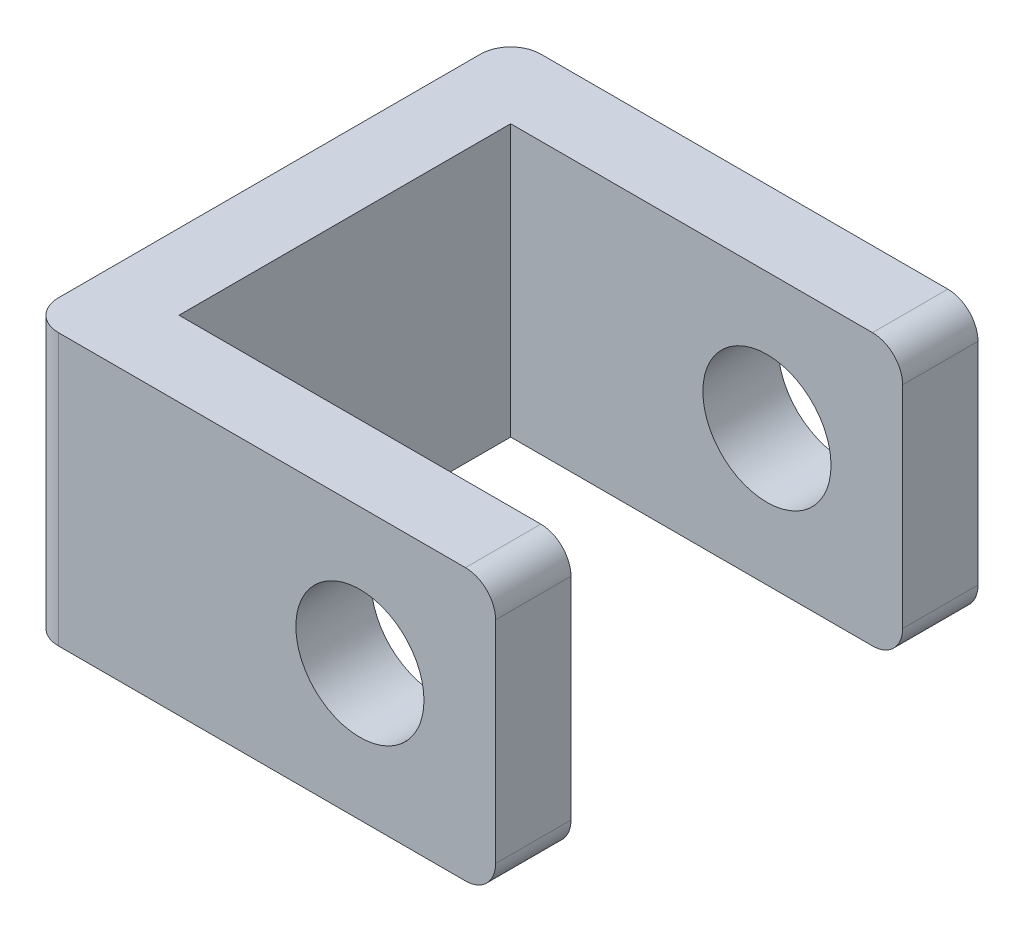
ISO-10303-21;
HEADER;
FILE_DESCRIPTION(('STEP AP214'),'2;1');
FILE_NAME('part.step','',(''),(''),'','','');
FILE_SCHEMA(('AUTOMOTIVE_DESIGN { 1 0 10303 214 1 1 1 1 }'));
ENDSEC;
DATA;
#1=APPLICATION_CONTEXT('core data for automotive mechanical design processes');
#2=APPLICATION_PROTOCOL_DEFINITION('international standard','automotive_design',2000,#1);
#3=PRODUCT_CONTEXT('',#1,'mechanical');
#4=PRODUCT('Part','Part','',(#3));
#5=PRODUCT_RELATED_PRODUCT_CATEGORY('part','',(#4));
#6=PRODUCT_DEFINITION_FORMATION('','',#4);
#7=PRODUCT_DEFINITION_CONTEXT('part definition',#1,'design');
#8=PRODUCT_DEFINITION('design','',#6,#7);
#9=PRODUCT_DEFINITION_SHAPE('','',#8);
#10=(LENGTH_UNIT() NAMED_UNIT(*) SI_UNIT(.MILLI.,.METRE.));
#11=(NAMED_UNIT(*) PLANE_ANGLE_UNIT() SI_UNIT($,.RADIAN.));
#12=(NAMED_UNIT(*) SI_UNIT($,.STERADIAN.) SOLID_ANGLE_UNIT());
#13=UNCERTAINTY_MEASURE_WITH_UNIT(LENGTH_MEASURE(1.E-05),#10,'distance_accuracy_value','');
#14=(GEOMETRIC_REPRESENTATION_CONTEXT(3) GLOBAL_UNCERTAINTY_ASSIGNED_CONTEXT((#13)) GLOBAL_UNIT_ASSIGNED_CONTEXT((#10,
#11,#12)) REPRESENTATION_CONTEXT('',''));
#15=CARTESIAN_POINT('',(0.,0.,0.));
#16=DIRECTION('',(0.,0.,1.));
#17=DIRECTION('',(1.,0.,0.));
#18=AXIS2_PLACEMENT_3D('',#15,#16,#17);
#19=CARTESIAN_POINT('',(2.,18.,14.));
#20=DIRECTION('',(0.,-1.,0.));
#21=DIRECTION('',(0.,0.,-1.));
#22=AXIS2_PLACEMENT_3D('',#19,#20,#21);
#23=CYLINDRICAL_SURFACE('',#22,2.);
#24=CARTESIAN_POINT('',(2.,0.,14.));
#25=DIRECTION('',(0.,1.,0.));
#26=DIRECTION('',(0.,0.,-1.));
#27=AXIS2_PLACEMENT_3D('',#24,#25,#26);
#28=CIRCLE('',#27,2.);
#29=CARTESIAN_POINT('',(0.,0.,14.));
#30=VERTEX_POINT('',#29);
#31=CARTESIAN_POINT('',(2.00000000000002,0.,16.));
#32=VERTEX_POINT('',#31);
#33=EDGE_CURVE('E163',#30,#32,#28,.T.);
#34=ORIENTED_EDGE('',*,*,#33,.T.);
#35=DIRECTION('',(0.,-1.,0.));
#36=VECTOR('',#35,1.);
#37=CARTESIAN_POINT('',(2.00000000000002,18.,16.));
#38=LINE('',#37,#36);
#39=CARTESIAN_POINT('',(2.00000000000002,18.,16.));
#40=VERTEX_POINT('',#39);
#41=EDGE_CURVE('E142',#40,#32,#38,.T.);
#42=ORIENTED_EDGE('',*,*,#41,.F.);
#43=CARTESIAN_POINT('',(2.,18.,14.));
#44=DIRECTION('',(0.,1.,0.));
#45=DIRECTION('',(0.,0.,-1.));
#46=AXIS2_PLACEMENT_3D('',#43,#44,#45);
#47=CIRCLE('',#46,2.);
#48=CARTESIAN_POINT('',(0.,18.,14.));
#49=VERTEX_POINT('',#48);
#50=EDGE_CURVE('E151',#49,#40,#47,.T.);
#51=ORIENTED_EDGE('',*,*,#50,.F.);
#52=DIRECTION('',(0.,-1.,0.));
#53=VECTOR('',#52,1.);
#54=CARTESIAN_POINT('',(0.,18.,14.));
#55=LINE('',#54,#53);
#56=EDGE_CURVE('E218',#49,#30,#55,.T.);
#57=ORIENTED_EDGE('',*,*,#56,.T.);
#58=EDGE_LOOP('',(#34,#42,#51,#57));
#59=FACE_BOUND('',#58,.T.);
#60=ADVANCED_FACE('F34',(#59),#23,.T.);
#61=CARTESIAN_POINT('',(2.00000000000002,18.,16.));
#62=DIRECTION('',(0.,0.,-1.));
#63=DIRECTION('',(-1.,0.,0.));
#64=AXIS2_PLACEMENT_3D('',#61,#62,#63);
#65=PLANE('',#64);
#66=CARTESIAN_POINT('',(22.,9.,16.));
#67=DIRECTION('',(0.,0.,1.));
#68=DIRECTION('',(1.,0.,0.));
#69=AXIS2_PLACEMENT_3D('',#66,#67,#68);
#70=CIRCLE('',#69,4.25);
#71=CARTESIAN_POINT('',(26.25,9.,16.));
#72=VERTEX_POINT('',#71);
#73=EDGE_CURVE('E442',#72,#72,#70,.T.);
#74=ORIENTED_EDGE('',*,*,#73,.F.);
#75=EDGE_LOOP('',(#74));
#76=FACE_BOUND('',#75,.T.);
#77=DIRECTION('',(1.,0.,0.));
#78=VECTOR('',#77,1.);
#79=CARTESIAN_POINT('',(2.00000000000002,0.,16.));
#80=LINE('',#79,#78);
#81=CARTESIAN_POINT('',(29.,0.,16.));
#82=VERTEX_POINT('',#81);
#83=EDGE_CURVE('E220',#32,#82,#80,.T.);
#84=ORIENTED_EDGE('',*,*,#83,.T.);
#85=CARTESIAN_POINT('',(29.,2.,16.));
#86=DIRECTION('',(0.,0.,-1.));
#87=DIRECTION('',(-1.,0.,0.));
#88=AXIS2_PLACEMENT_3D('',#85,#86,#87);
#89=CIRCLE('',#88,2.);
#90=CARTESIAN_POINT('',(31.,2.,16.));
#91=VERTEX_POINT('',#90);
#92=EDGE_CURVE('E185',#82,#91,#89,.F.);
#93=ORIENTED_EDGE('',*,*,#92,.T.);
#94=DIRECTION('',(0.,-1.,0.));
#95=VECTOR('',#94,1.);
#96=CARTESIAN_POINT('',(31.,18.,16.));
#97=LINE('',#96,#95);
#98=CARTESIAN_POINT('',(31.,16.,16.));
#99=VERTEX_POINT('',#98);
#100=EDGE_CURVE('E165',#99,#91,#97,.T.);
#101=ORIENTED_EDGE('',*,*,#100,.F.);
#102=CARTESIAN_POINT('',(29.,16.,16.));
#103=DIRECTION('',(0.,0.,-1.));
#104=DIRECTION('',(-1.,0.,0.));
#105=AXIS2_PLACEMENT_3D('',#102,#103,#104);
#106=CIRCLE('',#105,2.);
#107=CARTESIAN_POINT('',(29.,18.,16.));
#108=VERTEX_POINT('',#107);
#109=EDGE_CURVE('E146',#99,#108,#106,.F.);
#110=ORIENTED_EDGE('',*,*,#109,.T.);
#111=DIRECTION('',(1.,0.,0.));
#112=VECTOR('',#111,1.);
#113=CARTESIAN_POINT('',(2.00000000000002,18.,16.));
#114=LINE('',#113,#112);
#115=EDGE_CURVE('E137',#40,#108,#114,.T.);
#116=ORIENTED_EDGE('',*,*,#115,.F.);
#117=ORIENTED_EDGE('',*,*,#41,.T.);
#118=EDGE_LOOP('',(#84,#93,#101,#110,#116,#117));
#119=FACE_BOUND('',#118,.T.);
#120=ADVANCED_FACE('F140',(#76,#119),#65,.F.);
#121=CARTESIAN_POINT('',(31.,18.,16.));
#122=DIRECTION('',(-1.,0.,0.));
#123=DIRECTION('',(0.,0.,1.));
#124=AXIS2_PLACEMENT_3D('',#121,#122,#123);
#125=PLANE('',#124);
#126=ORIENTED_EDGE('',*,*,#100,.T.);
#127=DIRECTION('',(0.,0.,-1.));
#128=VECTOR('',#127,1.);
#129=CARTESIAN_POINT('',(31.,2.,11.));
#130=LINE('',#129,#128);
#131=CARTESIAN_POINT('',(31.,2.,11.));
#132=VERTEX_POINT('',#131);
#133=EDGE_CURVE('E167',#91,#132,#130,.T.);
#134=ORIENTED_EDGE('',*,*,#133,.T.);
#135=DIRECTION('',(0.,-1.,0.));
#136=VECTOR('',#135,1.);
#137=CARTESIAN_POINT('',(31.,18.,11.));
#138=LINE('',#137,#136);
#139=CARTESIAN_POINT('',(31.,16.,11.));
#140=VERTEX_POINT('',#139);
#141=EDGE_CURVE('E170',#140,#132,#138,.T.);
#142=ORIENTED_EDGE('',*,*,#141,.F.);
#143=DIRECTION('',(0.,0.,-1.));
#144=VECTOR('',#143,1.);
#145=CARTESIAN_POINT('',(31.,16.,16.));
#146=LINE('',#145,#144);
#147=EDGE_CURVE('E164',#140,#99,#146,.F.);
#148=ORIENTED_EDGE('',*,*,#147,.T.);
#149=EDGE_LOOP('',(#126,#134,#142,#148));
#150=FACE_BOUND('',#149,.T.);
#151=ADVANCED_FACE('F254',(#150),#125,.F.);
#152=CARTESIAN_POINT('',(31.,18.,11.));
#153=DIRECTION('',(0.,0.,1.));
#154=DIRECTION('',(1.,0.,0.));
#155=AXIS2_PLACEMENT_3D('',#152,#153,#154);
#156=PLANE('',#155);
#157=CARTESIAN_POINT('',(22.,9.,11.));
#158=DIRECTION('',(0.,0.,1.));
#159=DIRECTION('',(1.,0.,0.));
#160=AXIS2_PLACEMENT_3D('',#157,#158,#159);
#161=CIRCLE('',#160,4.25);
#162=CARTESIAN_POINT('',(26.25,9.,11.));
#163=VERTEX_POINT('',#162);
#164=EDGE_CURVE('E221',#163,#163,#161,.T.);
#165=ORIENTED_EDGE('',*,*,#164,.T.);
#166=EDGE_LOOP('',(#165));
#167=FACE_BOUND('',#166,.T.);
#168=ORIENTED_EDGE('',*,*,#141,.T.);
#169=CARTESIAN_POINT('',(29.,2.,11.));
#170=DIRECTION('',(0.,0.,1.));
#171=DIRECTION('',(1.,0.,0.));
#172=AXIS2_PLACEMENT_3D('',#169,#170,#171);
#173=CIRCLE('',#172,2.);
#174=CARTESIAN_POINT('',(29.,0.,11.));
#175=VERTEX_POINT('',#174);
#176=EDGE_CURVE('E178',#132,#175,#173,.F.);
#177=ORIENTED_EDGE('',*,*,#176,.T.);
#178=DIRECTION('',(-1.,0.,0.));
#179=VECTOR('',#178,1.);
#180=CARTESIAN_POINT('',(31.,0.,11.));
#181=LINE('',#180,#179);
#182=CARTESIAN_POINT('',(5.,0.,11.));
#183=VERTEX_POINT('',#182);
#184=EDGE_CURVE('E223',#175,#183,#181,.T.);
#185=ORIENTED_EDGE('',*,*,#184,.T.);
#186=DIRECTION('',(0.,-1.,0.));
#187=VECTOR('',#186,1.);
#188=CARTESIAN_POINT('',(5.,18.,11.));
#189=LINE('',#188,#187);
#190=CARTESIAN_POINT('',(5.,18.,11.));
#191=VERTEX_POINT('',#190);
#192=EDGE_CURVE('E205',#191,#183,#189,.T.);
#193=ORIENTED_EDGE('',*,*,#192,.F.);
#194=DIRECTION('',(-1.,0.,0.));
#195=VECTOR('',#194,1.);
#196=CARTESIAN_POINT('',(31.,18.,11.));
#197=LINE('',#196,#195);
#198=CARTESIAN_POINT('',(29.,18.,11.));
#199=VERTEX_POINT('',#198);
#200=EDGE_CURVE('E150',#199,#191,#197,.T.);
#201=ORIENTED_EDGE('',*,*,#200,.F.);
#202=CARTESIAN_POINT('',(29.,16.,11.));
#203=DIRECTION('',(0.,0.,1.));
#204=DIRECTION('',(1.,0.,0.));
#205=AXIS2_PLACEMENT_3D('',#202,#203,#204);
#206=CIRCLE('',#205,2.);
#207=EDGE_CURVE('E176',#199,#140,#206,.F.);
#208=ORIENTED_EDGE('',*,*,#207,.T.);
#209=EDGE_LOOP('',(#168,#177,#185,#193,#201,#208));
#210=FACE_BOUND('',#209,.T.);
#211=ADVANCED_FACE('F202',(#167,#210),#156,.F.);
#212=CARTESIAN_POINT('',(5.,18.,11.));
#213=DIRECTION('',(-1.,0.,0.));
#214=DIRECTION('',(0.,0.,1.));
#215=AXIS2_PLACEMENT_3D('',#212,#213,#214);
#216=PLANE('',#215);
#217=DIRECTION('',(0.,0.,-1.));
#218=VECTOR('',#217,1.);
#219=CARTESIAN_POINT('',(5.,0.,11.));
#220=LINE('',#219,#218);
#221=CARTESIAN_POINT('',(5.,0.,-11.));
#222=VERTEX_POINT('',#221);
#223=EDGE_CURVE('E225',#183,#222,#220,.T.);
#224=ORIENTED_EDGE('',*,*,#223,.T.);
#225=DIRECTION('',(0.,-1.,0.));
#226=VECTOR('',#225,1.);
#227=CARTESIAN_POINT('',(5.,18.,-11.));
#228=LINE('',#227,#226);
#229=CARTESIAN_POINT('',(5.,18.,-11.));
#230=VERTEX_POINT('',#229);
#231=EDGE_CURVE('E248',#230,#222,#228,.T.);
#232=ORIENTED_EDGE('',*,*,#231,.F.);
#233=DIRECTION('',(0.,0.,-1.));
#234=VECTOR('',#233,1.);
#235=CARTESIAN_POINT('',(5.,18.,11.));
#236=LINE('',#235,#234);
#237=EDGE_CURVE('E207',#191,#230,#236,.T.);
#238=ORIENTED_EDGE('',*,*,#237,.F.);
#239=ORIENTED_EDGE('',*,*,#192,.T.);
#240=EDGE_LOOP('',(#224,#232,#238,#239));
#241=FACE_BOUND('',#240,.T.);
#242=ADVANCED_FACE('F311',(#241),#216,.F.);
#243=CARTESIAN_POINT('',(5.,18.,-11.));
#244=DIRECTION('',(0.,0.,-1.));
#245=DIRECTION('',(-1.,0.,0.));
#246=AXIS2_PLACEMENT_3D('',#243,#244,#245);
#247=PLANE('',#246);
#248=CARTESIAN_POINT('',(22.,9.,-11.));
#249=DIRECTION('',(0.,0.,-1.));
#250=DIRECTION('',(-1.,0.,0.));
#251=AXIS2_PLACEMENT_3D('',#248,#249,#250);
#252=CIRCLE('',#251,4.25);
#253=CARTESIAN_POINT('',(17.75,9.,-11.));
#254=VERTEX_POINT('',#253);
#255=EDGE_CURVE('E445',#254,#254,#252,.T.);
#256=ORIENTED_EDGE('',*,*,#255,.T.);
#257=EDGE_LOOP('',(#256));
#258=FACE_BOUND('',#257,.T.);
#259=DIRECTION('',(1.,0.,0.));
#260=VECTOR('',#259,1.);
#261=CARTESIAN_POINT('',(5.,0.,-11.));
#262=LINE('',#261,#260);
#263=CARTESIAN_POINT('',(29.,0.,-11.));
#264=VERTEX_POINT('',#263);
#265=EDGE_CURVE('E227',#222,#264,#262,.T.);
#266=ORIENTED_EDGE('',*,*,#265,.T.);
#267=CARTESIAN_POINT('',(29.,2.,-11.));
#268=DIRECTION('',(0.,0.,-1.));
#269=DIRECTION('',(-1.,0.,0.));
#270=AXIS2_PLACEMENT_3D('',#267,#268,#269);
#271=CIRCLE('',#270,2.);
#272=CARTESIAN_POINT('',(31.,2.,-11.));
#273=VERTEX_POINT('',#272);
#274=EDGE_CURVE('E196',#264,#273,#271,.F.);
#275=ORIENTED_EDGE('',*,*,#274,.T.);
#276=DIRECTION('',(0.,-1.,0.));
#277=VECTOR('',#276,1.);
#278=CARTESIAN_POINT('',(31.,18.,-11.));
#279=LINE('',#278,#277);
#280=CARTESIAN_POINT('',(31.,16.,-11.));
#281=VERTEX_POINT('',#280);
#282=EDGE_CURVE('E245',#281,#273,#279,.T.);
#283=ORIENTED_EDGE('',*,*,#282,.F.);
#284=CARTESIAN_POINT('',(29.,16.,-11.));
#285=DIRECTION('',(0.,0.,-1.));
#286=DIRECTION('',(-1.,0.,0.));
#287=AXIS2_PLACEMENT_3D('',#284,#285,#286);
#288=CIRCLE('',#287,2.);
#289=CARTESIAN_POINT('',(29.,18.,-11.));
#290=VERTEX_POINT('',#289);
#291=EDGE_CURVE('E49',#281,#290,#288,.F.);
#292=ORIENTED_EDGE('',*,*,#291,.T.);
#293=DIRECTION('',(1.,0.,0.));
#294=VECTOR('',#293,1.);
#295=CARTESIAN_POINT('',(5.,18.,-11.));
#296=LINE('',#295,#294);
#297=EDGE_CURVE('E209',#230,#290,#296,.T.);
#298=ORIENTED_EDGE('',*,*,#297,.F.);
#299=ORIENTED_EDGE('',*,*,#231,.T.);
#300=EDGE_LOOP('',(#266,#275,#283,#292,#298,#299));
#301=FACE_BOUND('',#300,.T.);
#302=ADVANCED_FACE('F288',(#258,#301),#247,.F.);
#303=CARTESIAN_POINT('',(31.,18.,-11.));
#304=DIRECTION('',(-1.,0.,0.));
#305=DIRECTION('',(0.,0.,1.));
#306=AXIS2_PLACEMENT_3D('',#303,#304,#305);
#307=PLANE('',#306);
#308=ORIENTED_EDGE('',*,*,#282,.T.);
#309=DIRECTION('',(0.,0.,-1.));
#310=VECTOR('',#309,1.);
#311=CARTESIAN_POINT('',(31.,2.,-16.));
#312=LINE('',#311,#310);
#313=CARTESIAN_POINT('',(31.,2.,-16.));
#314=VERTEX_POINT('',#313);
#315=EDGE_CURVE('E189',#273,#314,#312,.T.);
#316=ORIENTED_EDGE('',*,*,#315,.T.);
#317=DIRECTION('',(0.,-1.,0.));
#318=VECTOR('',#317,1.);
#319=CARTESIAN_POINT('',(31.,18.,-16.));
#320=LINE('',#319,#318);
#321=CARTESIAN_POINT('',(31.,16.,-16.));
#322=VERTEX_POINT('',#321);
#323=EDGE_CURVE('E242',#322,#314,#320,.T.);
#324=ORIENTED_EDGE('',*,*,#323,.F.);
#325=DIRECTION('',(0.,0.,-1.));
#326=VECTOR('',#325,1.);
#327=CARTESIAN_POINT('',(31.,16.,-11.));
#328=LINE('',#327,#326);
#329=EDGE_CURVE('E187',#322,#281,#328,.F.);
#330=ORIENTED_EDGE('',*,*,#329,.T.);
#331=EDGE_LOOP('',(#308,#316,#324,#330));
#332=FACE_BOUND('',#331,.T.);
#333=ADVANCED_FACE('F291',(#332),#307,.F.);
#334=CARTESIAN_POINT('',(31.,18.,-16.));
#335=DIRECTION('',(0.,0.,1.));
#336=DIRECTION('',(1.,0.,0.));
#337=AXIS2_PLACEMENT_3D('',#334,#335,#336);
#338=PLANE('',#337);
#339=CARTESIAN_POINT('',(22.,9.,-16.));
#340=DIRECTION('',(0.,0.,1.));
#341=DIRECTION('',(1.,0.,0.));
#342=AXIS2_PLACEMENT_3D('',#339,#340,#341);
#343=CIRCLE('',#342,4.25);
#344=CARTESIAN_POINT('',(26.25,9.,-16.));
#345=VERTEX_POINT('',#344);
#346=EDGE_CURVE('E448',#345,#345,#343,.T.);
#347=ORIENTED_EDGE('',*,*,#346,.T.);
#348=EDGE_LOOP('',(#347));
#349=FACE_BOUND('',#348,.T.);
#350=ORIENTED_EDGE('',*,*,#323,.T.);
#351=CARTESIAN_POINT('',(29.,2.,-16.));
#352=DIRECTION('',(0.,0.,1.));
#353=DIRECTION('',(1.,0.,0.));
#354=AXIS2_PLACEMENT_3D('',#351,#352,#353);
#355=CIRCLE('',#354,2.);
#356=CARTESIAN_POINT('',(29.,0.,-16.));
#357=VERTEX_POINT('',#356);
#358=EDGE_CURVE('E193',#314,#357,#355,.F.);
#359=ORIENTED_EDGE('',*,*,#358,.T.);
#360=DIRECTION('',(-1.,0.,0.));
#361=VECTOR('',#360,1.);
#362=CARTESIAN_POINT('',(31.,0.,-16.));
#363=LINE('',#362,#361);
#364=CARTESIAN_POINT('',(2.00000000000001,0.,-16.));
#365=VERTEX_POINT('',#364);
#366=EDGE_CURVE('E230',#357,#365,#363,.T.);
#367=ORIENTED_EDGE('',*,*,#366,.T.);
#368=DIRECTION('',(0.,-1.,0.));
#369=VECTOR('',#368,1.);
#370=CARTESIAN_POINT('',(2.00000000000001,18.,-16.));
#371=LINE('',#370,#369);
#372=CARTESIAN_POINT('',(2.00000000000001,18.,-16.));
#373=VERTEX_POINT('',#372);
#374=EDGE_CURVE('E239',#373,#365,#371,.T.);
#375=ORIENTED_EDGE('',*,*,#374,.F.);
#376=DIRECTION('',(-1.,0.,0.));
#377=VECTOR('',#376,1.);
#378=CARTESIAN_POINT('',(31.,18.,-16.));
#379=LINE('',#378,#377);
#380=CARTESIAN_POINT('',(29.,18.,-16.));
#381=VERTEX_POINT('',#380);
#382=EDGE_CURVE('E213',#381,#373,#379,.T.);
#383=ORIENTED_EDGE('',*,*,#382,.F.);
#384=CARTESIAN_POINT('',(29.,16.,-16.));
#385=DIRECTION('',(0.,0.,1.));
#386=DIRECTION('',(1.,0.,0.));
#387=AXIS2_PLACEMENT_3D('',#384,#385,#386);
#388=CIRCLE('',#387,2.);
#389=EDGE_CURVE('E57',#381,#322,#388,.F.);
#390=ORIENTED_EDGE('',*,*,#389,.T.);
#391=EDGE_LOOP('',(#350,#359,#367,#375,#383,#390));
#392=FACE_BOUND('',#391,.T.);
#393=ADVANCED_FACE('F296',(#349,#392),#338,.F.);
#394=CARTESIAN_POINT('',(2.,18.,-14.));
#395=DIRECTION('',(0.,-1.,0.));
#396=DIRECTION('',(0.,0.,-1.));
#397=AXIS2_PLACEMENT_3D('',#394,#395,#396);
#398=CYLINDRICAL_SURFACE('',#397,2.);
#399=CARTESIAN_POINT('',(2.,0.,-14.));
#400=DIRECTION('',(0.,1.,0.));
#401=DIRECTION('',(0.,0.,-1.));
#402=AXIS2_PLACEMENT_3D('',#399,#400,#401);
#403=CIRCLE('',#402,2.);
#404=CARTESIAN_POINT('',(0.,0.,-14.));
#405=VERTEX_POINT('',#404);
#406=EDGE_CURVE('E232',#365,#405,#403,.T.);
#407=ORIENTED_EDGE('',*,*,#406,.T.);
#408=DIRECTION('',(0.,-1.,0.));
#409=VECTOR('',#408,1.);
#410=CARTESIAN_POINT('',(0.,18.,-14.));
#411=LINE('',#410,#409);
#412=CARTESIAN_POINT('',(0.,18.,-14.));
#413=VERTEX_POINT('',#412);
#414=EDGE_CURVE('E236',#413,#405,#411,.T.);
#415=ORIENTED_EDGE('',*,*,#414,.F.);
#416=CARTESIAN_POINT('',(2.,18.,-14.));
#417=DIRECTION('',(0.,1.,0.));
#418=DIRECTION('',(0.,0.,-1.));
#419=AXIS2_PLACEMENT_3D('',#416,#417,#418);
#420=CIRCLE('',#419,2.);
#421=EDGE_CURVE('E215',#373,#413,#420,.T.);
#422=ORIENTED_EDGE('',*,*,#421,.F.);
#423=ORIENTED_EDGE('',*,*,#374,.T.);
#424=EDGE_LOOP('',(#407,#415,#422,#423));
#425=FACE_BOUND('',#424,.T.);
#426=ADVANCED_FACE('F302',(#425),#398,.T.);
#427=CARTESIAN_POINT('',(0.,18.,-14.));
#428=DIRECTION('',(1.,0.,0.));
#429=DIRECTION('',(0.,0.,-1.));
#430=AXIS2_PLACEMENT_3D('',#427,#428,#429);
#431=PLANE('',#430);
#432=DIRECTION('',(0.,0.,1.));
#433=VECTOR('',#432,1.);
#434=CARTESIAN_POINT('',(0.,0.,-14.));
#435=LINE('',#434,#433);
#436=EDGE_CURVE('E160',#405,#30,#435,.T.);
#437=ORIENTED_EDGE('',*,*,#436,.T.);
#438=ORIENTED_EDGE('',*,*,#56,.F.);
#439=DIRECTION('',(0.,0.,1.));
#440=VECTOR('',#439,1.);
#441=CARTESIAN_POINT('',(0.,18.,-14.));
#442=LINE('',#441,#440);
#443=EDGE_CURVE('E156',#413,#49,#442,.T.);
#444=ORIENTED_EDGE('',*,*,#443,.F.);
#445=ORIENTED_EDGE('',*,*,#414,.T.);
#446=EDGE_LOOP('',(#437,#438,#444,#445));
#447=FACE_BOUND('',#446,.T.);
#448=ADVANCED_FACE('F305',(#447),#431,.F.);
#449=CARTESIAN_POINT('',(2.,18.,14.));
#450=DIRECTION('',(0.,-1.,0.));
#451=DIRECTION('',(0.,0.,-1.));
#452=AXIS2_PLACEMENT_3D('',#449,#450,#451);
#453=PLANE('',#452);
#454=ORIENTED_EDGE('',*,*,#297,.T.);
#455=DIRECTION('',(0.,0.,-1.));
#456=VECTOR('',#455,1.);
#457=CARTESIAN_POINT('',(29.,18.,14.));
#458=LINE('',#457,#456);
#459=EDGE_CURVE('E11',#290,#381,#458,.T.);
#460=ORIENTED_EDGE('',*,*,#459,.T.);
#461=ORIENTED_EDGE('',*,*,#382,.T.);
#462=ORIENTED_EDGE('',*,*,#421,.T.);
#463=ORIENTED_EDGE('',*,*,#443,.T.);
#464=ORIENTED_EDGE('',*,*,#50,.T.);
#465=ORIENTED_EDGE('',*,*,#115,.T.);
#466=DIRECTION('',(0.,0.,-1.));
#467=VECTOR('',#466,1.);
#468=CARTESIAN_POINT('',(29.,18.,14.));
#469=LINE('',#468,#467);
#470=EDGE_CURVE('E42',#108,#199,#469,.T.);
#471=ORIENTED_EDGE('',*,*,#470,.T.);
#472=ORIENTED_EDGE('',*,*,#200,.T.);
#473=ORIENTED_EDGE('',*,*,#237,.T.);
#474=EDGE_LOOP('',(#454,#460,#461,#462,#463,#464,#465,#471,#472,#473));
#475=FACE_BOUND('',#474,.T.);
#476=ADVANCED_FACE('F154',(#475),#453,.F.);
#477=CARTESIAN_POINT('',(2.,0.,14.));
#478=DIRECTION('',(0.,-1.,0.));
#479=DIRECTION('',(0.,0.,-1.));
#480=AXIS2_PLACEMENT_3D('',#477,#478,#479);
#481=PLANE('',#480);
#482=ORIENTED_EDGE('',*,*,#184,.F.);
#483=DIRECTION('',(0.,0.,-1.));
#484=VECTOR('',#483,1.);
#485=CARTESIAN_POINT('',(29.,0.,16.));
#486=LINE('',#485,#484);
#487=EDGE_CURVE('E182',#175,#82,#486,.F.);
#488=ORIENTED_EDGE('',*,*,#487,.T.);
#489=ORIENTED_EDGE('',*,*,#83,.F.);
#490=ORIENTED_EDGE('',*,*,#33,.F.);
#491=ORIENTED_EDGE('',*,*,#436,.F.);
#492=ORIENTED_EDGE('',*,*,#406,.F.);
#493=ORIENTED_EDGE('',*,*,#366,.F.);
#494=DIRECTION('',(0.,0.,-1.));
#495=VECTOR('',#494,1.);
#496=CARTESIAN_POINT('',(29.,0.,-11.));
#497=LINE('',#496,#495);
#498=EDGE_CURVE('E180',#357,#264,#497,.F.);
#499=ORIENTED_EDGE('',*,*,#498,.T.);
#500=ORIENTED_EDGE('',*,*,#265,.F.);
#501=ORIENTED_EDGE('',*,*,#223,.F.);
#502=EDGE_LOOP('',(#482,#488,#489,#490,#491,#492,#493,#499,#500,#501));
#503=FACE_BOUND('',#502,.T.);
#504=ADVANCED_FACE('F279',(#503),#481,.T.);
#505=CARTESIAN_POINT('',(29.,2.,16.));
#506=DIRECTION('',(0.,0.,1.));
#507=DIRECTION('',(1.,0.,0.));
#508=AXIS2_PLACEMENT_3D('',#505,#506,#507);
#509=CYLINDRICAL_SURFACE('',#508,2.);
#510=ORIENTED_EDGE('',*,*,#92,.F.);
#511=ORIENTED_EDGE('',*,*,#487,.F.);
#512=ORIENTED_EDGE('',*,*,#176,.F.);
#513=ORIENTED_EDGE('',*,*,#133,.F.);
#514=EDGE_LOOP('',(#510,#511,#512,#513));
#515=FACE_BOUND('',#514,.T.);
#516=ADVANCED_FACE('F276',(#515),#509,.T.);
#517=CARTESIAN_POINT('',(29.,2.,-11.));
#518=DIRECTION('',(0.,0.,1.));
#519=DIRECTION('',(1.,0.,0.));
#520=AXIS2_PLACEMENT_3D('',#517,#518,#519);
#521=CYLINDRICAL_SURFACE('',#520,2.);
#522=ORIENTED_EDGE('',*,*,#274,.F.);
#523=ORIENTED_EDGE('',*,*,#498,.F.);
#524=ORIENTED_EDGE('',*,*,#358,.F.);
#525=ORIENTED_EDGE('',*,*,#315,.F.);
#526=EDGE_LOOP('',(#522,#523,#524,#525));
#527=FACE_BOUND('',#526,.T.);
#528=ADVANCED_FACE('F266',(#527),#521,.T.);
#529=CARTESIAN_POINT('',(29.,16.,14.));
#530=DIRECTION('',(0.,0.,-1.));
#531=DIRECTION('',(-1.,0.,0.));
#532=AXIS2_PLACEMENT_3D('',#529,#530,#531);
#533=CYLINDRICAL_SURFACE('',#532,2.);
#534=ORIENTED_EDGE('',*,*,#291,.F.);
#535=ORIENTED_EDGE('',*,*,#329,.F.);
#536=ORIENTED_EDGE('',*,*,#389,.F.);
#537=ORIENTED_EDGE('',*,*,#459,.F.);
#538=EDGE_LOOP('',(#534,#535,#536,#537));
#539=FACE_BOUND('',#538,.T.);
#540=ADVANCED_FACE('F258',(#539),#533,.T.);
#541=CARTESIAN_POINT('',(29.,16.,14.));
#542=DIRECTION('',(0.,0.,-1.));
#543=DIRECTION('',(-1.,0.,0.));
#544=AXIS2_PLACEMENT_3D('',#541,#542,#543);
#545=CYLINDRICAL_SURFACE('',#544,2.);
#546=ORIENTED_EDGE('',*,*,#109,.F.);
#547=ORIENTED_EDGE('',*,*,#147,.F.);
#548=ORIENTED_EDGE('',*,*,#207,.F.);
#549=ORIENTED_EDGE('',*,*,#470,.F.);
#550=EDGE_LOOP('',(#546,#547,#548,#549));
#551=FACE_BOUND('',#550,.T.);
#552=ADVANCED_FACE('F36',(#551),#545,.T.);
#553=CARTESIAN_POINT('',(22.,9.,-16.));
#554=DIRECTION('',(0.,0.,1.));
#555=DIRECTION('',(1.,0.,0.));
#556=AXIS2_PLACEMENT_3D('',#553,#554,#555);
#557=CYLINDRICAL_SURFACE('',#556,4.25);
#558=ORIENTED_EDGE('',*,*,#346,.F.);
#559=EDGE_LOOP('',(#558));
#560=FACE_BOUND('',#559,.T.);
#561=ORIENTED_EDGE('',*,*,#255,.F.);
#562=EDGE_LOOP('',(#561));
#563=FACE_BOUND('',#562,.T.);
#564=ADVANCED_FACE('F257',(#560,#563),#557,.F.);
#565=ORIENTED_EDGE('',*,*,#73,.T.);
#566=EDGE_LOOP('',(#565));
#567=FACE_BOUND('',#566,.T.);
#568=ORIENTED_EDGE('',*,*,#164,.F.);
#569=EDGE_LOOP('',(#568));
#570=FACE_BOUND('',#569,.T.);
#571=ADVANCED_FACE('F263',(#567,#570),#557,.F.);
#572=CLOSED_SHELL('',(#60,#120,#151,#211,#242,#302,#333,#393,#426,#448,#476,#504,#516,#528,#540,
#552,#564,#571));
#573=MANIFOLD_SOLID_BREP('B2',#572);
#574=ADVANCED_BREP_SHAPE_REPRESENTATION('',(#18,#573),#14);
#575=SHAPE_DEFINITION_REPRESENTATION(#9,#574);
ENDSEC;
END-ISO-10303-21;
